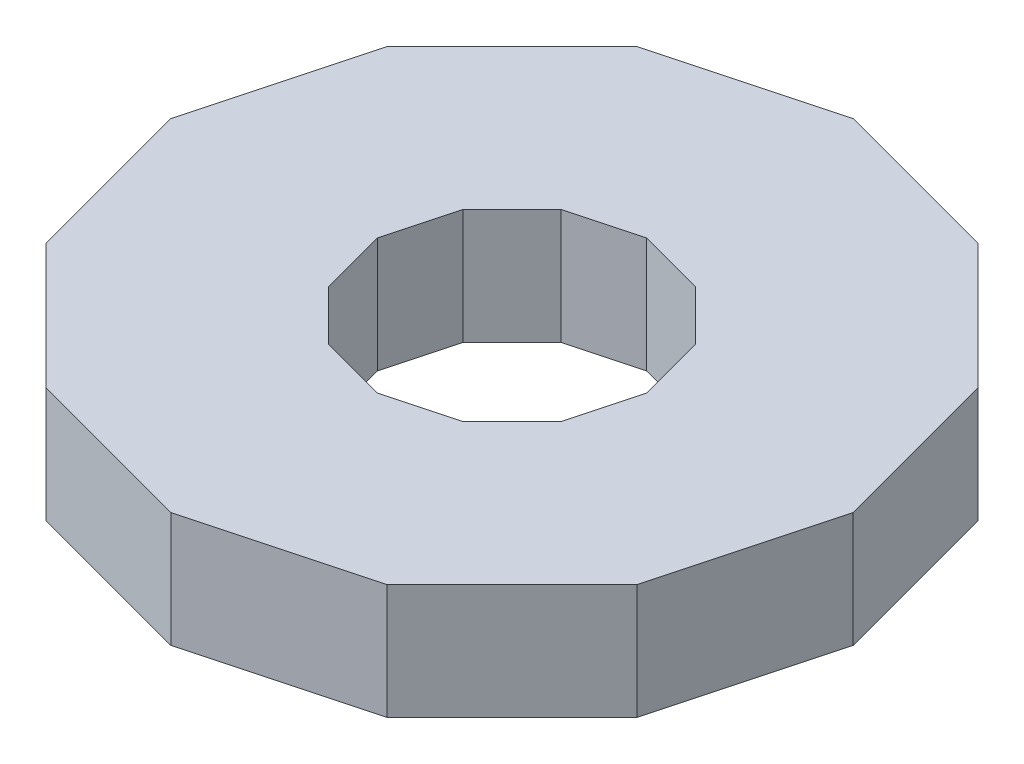
ISO-10303-21;
HEADER;
FILE_DESCRIPTION(('STEP AP214'),'2;1');
FILE_NAME('part.step','',(''),(''),'','','');
FILE_SCHEMA(('AUTOMOTIVE_DESIGN { 1 0 10303 214 1 1 1 1 }'));
ENDSEC;
DATA;
#1=APPLICATION_CONTEXT('core data for automotive mechanical design processes');
#2=APPLICATION_PROTOCOL_DEFINITION('international standard','automotive_design',2000,#1);
#3=PRODUCT_CONTEXT('',#1,'mechanical');
#4=PRODUCT('Part','Part','',(#3));
#5=PRODUCT_RELATED_PRODUCT_CATEGORY('part','',(#4));
#6=PRODUCT_DEFINITION_FORMATION('','',#4);
#7=PRODUCT_DEFINITION_CONTEXT('part definition',#1,'design');
#8=PRODUCT_DEFINITION('design','',#6,#7);
#9=PRODUCT_DEFINITION_SHAPE('','',#8);
#10=(LENGTH_UNIT() NAMED_UNIT(*) SI_UNIT(.MILLI.,.METRE.));
#11=(NAMED_UNIT(*) PLANE_ANGLE_UNIT() SI_UNIT($,.RADIAN.));
#12=(NAMED_UNIT(*) SI_UNIT($,.STERADIAN.) SOLID_ANGLE_UNIT());
#13=UNCERTAINTY_MEASURE_WITH_UNIT(LENGTH_MEASURE(1.E-05),#10,'distance_accuracy_value','');
#14=(GEOMETRIC_REPRESENTATION_CONTEXT(3) GLOBAL_UNCERTAINTY_ASSIGNED_CONTEXT((#13)) GLOBAL_UNIT_ASSIGNED_CONTEXT((#10,
#11,#12)) REPRESENTATION_CONTEXT('',''));
#15=CARTESIAN_POINT('',(0.,0.,0.));
#16=DIRECTION('',(0.,0.,1.));
#17=DIRECTION('',(1.,0.,0.));
#18=AXIS2_PLACEMENT_3D('',#15,#16,#17);
#19=CARTESIAN_POINT('',(0.,19.05,0.));
#20=DIRECTION('',(0.,1.,0.));
#21=DIRECTION('',(0.,0.,1.));
#22=AXIS2_PLACEMENT_3D('',#19,#20,#21);
#23=PLANE('',#22);
#24=DIRECTION('',(0.258819045102521,0.,-0.965925826289068));
#25=VECTOR('',#24,1.);
#26=CARTESIAN_POINT('',(48.8692824643627,19.05,28.2146933859037));
#27=LINE('',#26,#25);
#28=CARTESIAN_POINT('',(48.8692824643627,19.05,28.2146933859037));
#29=VERTEX_POINT('',#28);
#30=CARTESIAN_POINT('',(56.4293867718074,19.05,0.));
#31=VERTEX_POINT('',#30);
#32=EDGE_CURVE('E304',#29,#31,#27,.T.);
#33=ORIENTED_EDGE('',*,*,#32,.T.);
#34=DIRECTION('',(-0.25881904510252,0.,-0.965925826289068));
#35=VECTOR('',#34,1.);
#36=CARTESIAN_POINT('',(56.4293867718074,19.05,0.));
#37=LINE('',#36,#35);
#38=CARTESIAN_POINT('',(48.8692824643627,19.05,-28.2146933859037));
#39=VERTEX_POINT('',#38);
#40=EDGE_CURVE('E308',#31,#39,#37,.T.);
#41=ORIENTED_EDGE('',*,*,#40,.T.);
#42=DIRECTION('',(-0.707106781186547,0.,-0.707106781186547));
#43=VECTOR('',#42,1.);
#44=CARTESIAN_POINT('',(48.8692824643627,19.05,-28.2146933859037));
#45=LINE('',#44,#43);
#46=CARTESIAN_POINT('',(28.2146933859037,19.05,-48.8692824643627));
#47=VERTEX_POINT('',#46);
#48=EDGE_CURVE('E312',#39,#47,#45,.T.);
#49=ORIENTED_EDGE('',*,*,#48,.T.);
#50=DIRECTION('',(-0.965925826289068,0.,-0.258819045102521));
#51=VECTOR('',#50,1.);
#52=CARTESIAN_POINT('',(28.2146933859037,19.05,-48.8692824643627));
#53=LINE('',#52,#51);
#54=CARTESIAN_POINT('',(0.,19.05,-56.4293867718074));
#55=VERTEX_POINT('',#54);
#56=EDGE_CURVE('E315',#47,#55,#53,.T.);
#57=ORIENTED_EDGE('',*,*,#56,.T.);
#58=DIRECTION('',(-0.965925826289068,0.,0.25881904510252));
#59=VECTOR('',#58,1.);
#60=CARTESIAN_POINT('',(0.,19.05,-56.4293867718074));
#61=LINE('',#60,#59);
#62=CARTESIAN_POINT('',(-28.2146933859037,19.05,-48.8692824643628));
#63=VERTEX_POINT('',#62);
#64=EDGE_CURVE('E318',#55,#63,#61,.T.);
#65=ORIENTED_EDGE('',*,*,#64,.T.);
#66=DIRECTION('',(-0.707106781186548,0.,0.707106781186547));
#67=VECTOR('',#66,1.);
#68=CARTESIAN_POINT('',(-28.2146933859037,19.05,-48.8692824643628));
#69=LINE('',#68,#67);
#70=CARTESIAN_POINT('',(-48.8692824643627,19.05,-28.2146933859037));
#71=VERTEX_POINT('',#70);
#72=EDGE_CURVE('E321',#63,#71,#69,.T.);
#73=ORIENTED_EDGE('',*,*,#72,.T.);
#74=DIRECTION('',(-0.258819045102521,0.,0.965925826289068));
#75=VECTOR('',#74,1.);
#76=CARTESIAN_POINT('',(-48.8692824643627,19.05,-28.2146933859037));
#77=LINE('',#76,#75);
#78=CARTESIAN_POINT('',(-56.4293867718074,19.05,0.));
#79=VERTEX_POINT('',#78);
#80=EDGE_CURVE('E324',#71,#79,#77,.T.);
#81=ORIENTED_EDGE('',*,*,#80,.T.);
#82=DIRECTION('',(0.25881904510252,0.,0.965925826289068));
#83=VECTOR('',#82,1.);
#84=CARTESIAN_POINT('',(-56.4293867718074,19.05,0.));
#85=LINE('',#84,#83);
#86=CARTESIAN_POINT('',(-48.8692824643628,19.05,28.2146933859037));
#87=VERTEX_POINT('',#86);
#88=EDGE_CURVE('E327',#79,#87,#85,.T.);
#89=ORIENTED_EDGE('',*,*,#88,.T.);
#90=DIRECTION('',(0.707106781186547,0.,0.707106781186548));
#91=VECTOR('',#90,1.);
#92=CARTESIAN_POINT('',(-48.8692824643628,19.05,28.2146933859037));
#93=LINE('',#92,#91);
#94=CARTESIAN_POINT('',(-28.2146933859037,19.05,48.8692824643627));
#95=VERTEX_POINT('',#94);
#96=EDGE_CURVE('E329',#87,#95,#93,.T.);
#97=ORIENTED_EDGE('',*,*,#96,.T.);
#98=DIRECTION('',(0.965925826289068,0.,0.258819045102521));
#99=VECTOR('',#98,1.);
#100=CARTESIAN_POINT('',(-28.2146933859037,19.05,48.8692824643627));
#101=LINE('',#100,#99);
#102=CARTESIAN_POINT('',(0.,19.05,56.4293867718074));
#103=VERTEX_POINT('',#102);
#104=EDGE_CURVE('E332',#95,#103,#101,.T.);
#105=ORIENTED_EDGE('',*,*,#104,.T.);
#106=DIRECTION('',(0.965925826289068,0.,-0.25881904510252));
#107=VECTOR('',#106,1.);
#108=CARTESIAN_POINT('',(0.,19.05,56.4293867718074));
#109=LINE('',#108,#107);
#110=CARTESIAN_POINT('',(28.2146933859037,19.05,48.8692824643628));
#111=VERTEX_POINT('',#110);
#112=EDGE_CURVE('E334',#103,#111,#109,.T.);
#113=ORIENTED_EDGE('',*,*,#112,.T.);
#114=DIRECTION('',(0.707106781186548,0.,-0.707106781186547));
#115=VECTOR('',#114,1.);
#116=CARTESIAN_POINT('',(28.2146933859037,19.05,48.8692824643628));
#117=LINE('',#116,#115);
#118=EDGE_CURVE('E336',#111,#29,#117,.T.);
#119=ORIENTED_EDGE('',*,*,#118,.T.);
#120=EDGE_LOOP('',(#33,#41,#49,#57,#65,#73,#81,#89,#97,#105,#113,#119));
#121=FACE_BOUND('',#120,.T.);
#122=DIRECTION('',(-0.25881904510252,0.,-0.965925826289069));
#123=VECTOR('',#122,1.);
#124=CARTESIAN_POINT('',(22.2445672946664,19.05,0.));
#125=LINE('',#124,#123);
#126=CARTESIAN_POINT('',(22.2445672946664,19.05,0.));
#127=VERTEX_POINT('',#126);
#128=CARTESIAN_POINT('',(19.2643603733736,19.05,-11.1222836473332));
#129=VERTEX_POINT('',#128);
#130=EDGE_CURVE('E204',#127,#129,#125,.T.);
#131=ORIENTED_EDGE('',*,*,#130,.F.);
#132=DIRECTION('',(0.258819045102521,0.,-0.965925826289068));
#133=VECTOR('',#132,1.);
#134=CARTESIAN_POINT('',(19.2643603733736,19.05,11.1222836473332));
#135=LINE('',#134,#133);
#136=CARTESIAN_POINT('',(19.2643603733736,19.05,11.1222836473332));
#137=VERTEX_POINT('',#136);
#138=EDGE_CURVE('E195',#137,#127,#135,.T.);
#139=ORIENTED_EDGE('',*,*,#138,.F.);
#140=DIRECTION('',(0.707106781186548,0.,-0.707106781186547));
#141=VECTOR('',#140,1.);
#142=CARTESIAN_POINT('',(11.1222836473332,19.05,19.2643603733736));
#143=LINE('',#142,#141);
#144=CARTESIAN_POINT('',(11.1222836473332,19.05,19.2643603733736));
#145=VERTEX_POINT('',#144);
#146=EDGE_CURVE('E241',#145,#137,#143,.T.);
#147=ORIENTED_EDGE('',*,*,#146,.F.);
#148=DIRECTION('',(0.965925826289069,0.,-0.25881904510252));
#149=VECTOR('',#148,1.);
#150=CARTESIAN_POINT('',(0.,19.05,22.2445672946664));
#151=LINE('',#150,#149);
#152=CARTESIAN_POINT('',(0.,19.05,22.2445672946664));
#153=VERTEX_POINT('',#152);
#154=EDGE_CURVE('E239',#153,#145,#151,.T.);
#155=ORIENTED_EDGE('',*,*,#154,.F.);
#156=DIRECTION('',(0.965925826289068,0.,0.258819045102521));
#157=VECTOR('',#156,1.);
#158=CARTESIAN_POINT('',(-11.1222836473332,19.05,19.2643603733736));
#159=LINE('',#158,#157);
#160=CARTESIAN_POINT('',(-11.1222836473332,19.05,19.2643603733736));
#161=VERTEX_POINT('',#160);
#162=EDGE_CURVE('E237',#161,#153,#159,.T.);
#163=ORIENTED_EDGE('',*,*,#162,.F.);
#164=DIRECTION('',(0.707106781186547,0.,0.707106781186547));
#165=VECTOR('',#164,1.);
#166=CARTESIAN_POINT('',(-19.2643603733736,19.05,11.1222836473332));
#167=LINE('',#166,#165);
#168=CARTESIAN_POINT('',(-19.2643603733736,19.05,11.1222836473332));
#169=VERTEX_POINT('',#168);
#170=EDGE_CURVE('E235',#169,#161,#167,.T.);
#171=ORIENTED_EDGE('',*,*,#170,.F.);
#172=DIRECTION('',(0.25881904510252,0.,0.965925826289068));
#173=VECTOR('',#172,1.);
#174=CARTESIAN_POINT('',(-22.2445672946664,19.05,0.));
#175=LINE('',#174,#173);
#176=CARTESIAN_POINT('',(-22.2445672946664,19.05,0.));
#177=VERTEX_POINT('',#176);
#178=EDGE_CURVE('E233',#177,#169,#175,.T.);
#179=ORIENTED_EDGE('',*,*,#178,.F.);
#180=DIRECTION('',(-0.258819045102521,0.,0.965925826289068));
#181=VECTOR('',#180,1.);
#182=CARTESIAN_POINT('',(-19.2643603733736,19.05,-11.1222836473332));
#183=LINE('',#182,#181);
#184=CARTESIAN_POINT('',(-19.2643603733736,19.05,-11.1222836473332));
#185=VERTEX_POINT('',#184);
#186=EDGE_CURVE('E230',#185,#177,#183,.T.);
#187=ORIENTED_EDGE('',*,*,#186,.F.);
#188=DIRECTION('',(-0.707106781186548,0.,0.707106781186547));
#189=VECTOR('',#188,1.);
#190=CARTESIAN_POINT('',(-11.1222836473332,19.05,-19.2643603733736));
#191=LINE('',#190,#189);
#192=CARTESIAN_POINT('',(-11.1222836473332,19.05,-19.2643603733736));
#193=VERTEX_POINT('',#192);
#194=EDGE_CURVE('E228',#193,#185,#191,.T.);
#195=ORIENTED_EDGE('',*,*,#194,.F.);
#196=DIRECTION('',(-0.965925826289068,0.,0.258819045102521));
#197=VECTOR('',#196,1.);
#198=CARTESIAN_POINT('',(0.,19.05,-22.2445672946664));
#199=LINE('',#198,#197);
#200=CARTESIAN_POINT('',(0.,19.05,-22.2445672946664));
#201=VERTEX_POINT('',#200);
#202=EDGE_CURVE('E226',#201,#193,#199,.T.);
#203=ORIENTED_EDGE('',*,*,#202,.F.);
#204=DIRECTION('',(-0.965925826289068,0.,-0.258819045102521));
#205=VECTOR('',#204,1.);
#206=CARTESIAN_POINT('',(11.1222836473332,19.05,-19.2643603733736));
#207=LINE('',#206,#205);
#208=CARTESIAN_POINT('',(11.1222836473332,19.05,-19.2643603733736));
#209=VERTEX_POINT('',#208);
#210=EDGE_CURVE('E222',#209,#201,#207,.T.);
#211=ORIENTED_EDGE('',*,*,#210,.F.);
#212=DIRECTION('',(-0.707106781186547,0.,-0.707106781186548));
#213=VECTOR('',#212,1.);
#214=CARTESIAN_POINT('',(19.2643603733736,19.05,-11.1222836473332));
#215=LINE('',#214,#213);
#216=EDGE_CURVE('E217',#129,#209,#215,.T.);
#217=ORIENTED_EDGE('',*,*,#216,.F.);
#218=EDGE_LOOP('',(#131,#139,#147,#155,#163,#171,#179,#187,#195,#203,#211,#217));
#219=FACE_BOUND('',#218,.T.);
#220=ADVANCED_FACE('F34',(#121,#219),#23,.T.);
#221=CARTESIAN_POINT('',(0.,0.,0.));
#222=DIRECTION('',(0.,1.,0.));
#223=DIRECTION('',(0.,0.,1.));
#224=AXIS2_PLACEMENT_3D('',#221,#222,#223);
#225=PLANE('',#224);
#226=DIRECTION('',(0.258819045102521,0.,-0.965925826289068));
#227=VECTOR('',#226,1.);
#228=CARTESIAN_POINT('',(48.8692824643627,0.,28.2146933859037));
#229=LINE('',#228,#227);
#230=CARTESIAN_POINT('',(48.8692824643627,0.,28.2146933859037));
#231=VERTEX_POINT('',#230);
#232=CARTESIAN_POINT('',(56.4293867718074,0.,0.));
#233=VERTEX_POINT('',#232);
#234=EDGE_CURVE('E212',#231,#233,#229,.T.);
#235=ORIENTED_EDGE('',*,*,#234,.F.);
#236=DIRECTION('',(0.707106781186548,0.,-0.707106781186547));
#237=VECTOR('',#236,1.);
#238=CARTESIAN_POINT('',(28.2146933859037,0.,48.8692824643628));
#239=LINE('',#238,#237);
#240=CARTESIAN_POINT('',(28.2146933859037,0.,48.8692824643628));
#241=VERTEX_POINT('',#240);
#242=EDGE_CURVE('E309',#241,#231,#239,.T.);
#243=ORIENTED_EDGE('',*,*,#242,.F.);
#244=DIRECTION('',(0.965925826289068,0.,-0.25881904510252));
#245=VECTOR('',#244,1.);
#246=CARTESIAN_POINT('',(0.,0.,56.4293867718074));
#247=LINE('',#246,#245);
#248=CARTESIAN_POINT('',(0.,0.,56.4293867718074));
#249=VERTEX_POINT('',#248);
#250=EDGE_CURVE('E362',#249,#241,#247,.T.);
#251=ORIENTED_EDGE('',*,*,#250,.F.);
#252=DIRECTION('',(0.965925826289068,0.,0.258819045102521));
#253=VECTOR('',#252,1.);
#254=CARTESIAN_POINT('',(-28.2146933859037,0.,48.8692824643627));
#255=LINE('',#254,#253);
#256=CARTESIAN_POINT('',(-28.2146933859037,0.,48.8692824643627));
#257=VERTEX_POINT('',#256);
#258=EDGE_CURVE('E359',#257,#249,#255,.T.);
#259=ORIENTED_EDGE('',*,*,#258,.F.);
#260=DIRECTION('',(0.707106781186547,0.,0.707106781186548));
#261=VECTOR('',#260,1.);
#262=CARTESIAN_POINT('',(-48.8692824643628,0.,28.2146933859037));
#263=LINE('',#262,#261);
#264=CARTESIAN_POINT('',(-48.8692824643628,0.,28.2146933859037));
#265=VERTEX_POINT('',#264);
#266=EDGE_CURVE('E356',#265,#257,#263,.T.);
#267=ORIENTED_EDGE('',*,*,#266,.F.);
#268=DIRECTION('',(0.25881904510252,0.,0.965925826289068));
#269=VECTOR('',#268,1.);
#270=CARTESIAN_POINT('',(-56.4293867718074,0.,0.));
#271=LINE('',#270,#269);
#272=CARTESIAN_POINT('',(-56.4293867718074,0.,0.));
#273=VERTEX_POINT('',#272);
#274=EDGE_CURVE('E354',#273,#265,#271,.T.);
#275=ORIENTED_EDGE('',*,*,#274,.F.);
#276=DIRECTION('',(-0.258819045102521,0.,0.965925826289068));
#277=VECTOR('',#276,1.);
#278=CARTESIAN_POINT('',(-48.8692824643627,0.,-28.2146933859037));
#279=LINE('',#278,#277);
#280=CARTESIAN_POINT('',(-48.8692824643627,0.,-28.2146933859037));
#281=VERTEX_POINT('',#280);
#282=EDGE_CURVE('E352',#281,#273,#279,.T.);
#283=ORIENTED_EDGE('',*,*,#282,.F.);
#284=DIRECTION('',(-0.707106781186548,0.,0.707106781186547));
#285=VECTOR('',#284,1.);
#286=CARTESIAN_POINT('',(-28.2146933859037,0.,-48.8692824643628));
#287=LINE('',#286,#285);
#288=CARTESIAN_POINT('',(-28.2146933859037,0.,-48.8692824643628));
#289=VERTEX_POINT('',#288);
#290=EDGE_CURVE('E350',#289,#281,#287,.T.);
#291=ORIENTED_EDGE('',*,*,#290,.F.);
#292=DIRECTION('',(-0.965925826289068,0.,0.25881904510252));
#293=VECTOR('',#292,1.);
#294=CARTESIAN_POINT('',(0.,0.,-56.4293867718074));
#295=LINE('',#294,#293);
#296=CARTESIAN_POINT('',(0.,0.,-56.4293867718074));
#297=VERTEX_POINT('',#296);
#298=EDGE_CURVE('E348',#297,#289,#295,.T.);
#299=ORIENTED_EDGE('',*,*,#298,.F.);
#300=DIRECTION('',(-0.965925826289068,0.,-0.258819045102521));
#301=VECTOR('',#300,1.);
#302=CARTESIAN_POINT('',(28.2146933859037,0.,-48.8692824643627));
#303=LINE('',#302,#301);
#304=CARTESIAN_POINT('',(28.2146933859037,0.,-48.8692824643627));
#305=VERTEX_POINT('',#304);
#306=EDGE_CURVE('E345',#305,#297,#303,.T.);
#307=ORIENTED_EDGE('',*,*,#306,.F.);
#308=DIRECTION('',(-0.707106781186547,0.,-0.707106781186547));
#309=VECTOR('',#308,1.);
#310=CARTESIAN_POINT('',(48.8692824643627,0.,-28.2146933859037));
#311=LINE('',#310,#309);
#312=CARTESIAN_POINT('',(48.8692824643627,0.,-28.2146933859037));
#313=VERTEX_POINT('',#312);
#314=EDGE_CURVE('E343',#313,#305,#311,.T.);
#315=ORIENTED_EDGE('',*,*,#314,.F.);
#316=DIRECTION('',(-0.25881904510252,0.,-0.965925826289068));
#317=VECTOR('',#316,1.);
#318=CARTESIAN_POINT('',(56.4293867718074,0.,0.));
#319=LINE('',#318,#317);
#320=EDGE_CURVE('E341',#233,#313,#319,.T.);
#321=ORIENTED_EDGE('',*,*,#320,.F.);
#322=EDGE_LOOP('',(#235,#243,#251,#259,#267,#275,#283,#291,#299,#307,#315,#321));
#323=FACE_BOUND('',#322,.T.);
#324=DIRECTION('',(0.258819045102521,0.,-0.965925826289068));
#325=VECTOR('',#324,1.);
#326=CARTESIAN_POINT('',(19.2643603733736,0.,11.1222836473332));
#327=LINE('',#326,#325);
#328=CARTESIAN_POINT('',(19.2643603733736,0.,11.1222836473332));
#329=VERTEX_POINT('',#328);
#330=CARTESIAN_POINT('',(22.2445672946664,0.,0.));
#331=VERTEX_POINT('',#330);
#332=EDGE_CURVE('E57',#329,#331,#327,.T.);
#333=ORIENTED_EDGE('',*,*,#332,.T.);
#334=DIRECTION('',(-0.25881904510252,0.,-0.965925826289069));
#335=VECTOR('',#334,1.);
#336=CARTESIAN_POINT('',(22.2445672946664,0.,0.));
#337=LINE('',#336,#335);
#338=CARTESIAN_POINT('',(19.2643603733736,0.,-11.1222836473332));
#339=VERTEX_POINT('',#338);
#340=EDGE_CURVE('E211',#331,#339,#337,.T.);
#341=ORIENTED_EDGE('',*,*,#340,.T.);
#342=DIRECTION('',(-0.707106781186547,0.,-0.707106781186548));
#343=VECTOR('',#342,1.);
#344=CARTESIAN_POINT('',(19.2643603733736,0.,-11.1222836473332));
#345=LINE('',#344,#343);
#346=CARTESIAN_POINT('',(11.1222836473332,0.,-19.2643603733736));
#347=VERTEX_POINT('',#346);
#348=EDGE_CURVE('E248',#339,#347,#345,.T.);
#349=ORIENTED_EDGE('',*,*,#348,.T.);
#350=DIRECTION('',(-0.965925826289068,0.,-0.258819045102521));
#351=VECTOR('',#350,1.);
#352=CARTESIAN_POINT('',(11.1222836473332,0.,-19.2643603733736));
#353=LINE('',#352,#351);
#354=CARTESIAN_POINT('',(0.,0.,-22.2445672946664));
#355=VERTEX_POINT('',#354);
#356=EDGE_CURVE('E251',#347,#355,#353,.T.);
#357=ORIENTED_EDGE('',*,*,#356,.T.);
#358=DIRECTION('',(-0.965925826289068,0.,0.258819045102521));
#359=VECTOR('',#358,1.);
#360=CARTESIAN_POINT('',(0.,0.,-22.2445672946664));
#361=LINE('',#360,#359);
#362=CARTESIAN_POINT('',(-11.1222836473332,0.,-19.2643603733736));
#363=VERTEX_POINT('',#362);
#364=EDGE_CURVE('E255',#355,#363,#361,.T.);
#365=ORIENTED_EDGE('',*,*,#364,.T.);
#366=DIRECTION('',(-0.707106781186548,0.,0.707106781186547));
#367=VECTOR('',#366,1.);
#368=CARTESIAN_POINT('',(-11.1222836473332,0.,-19.2643603733736));
#369=LINE('',#368,#367);
#370=CARTESIAN_POINT('',(-19.2643603733736,0.,-11.1222836473332));
#371=VERTEX_POINT('',#370);
#372=EDGE_CURVE('E259',#363,#371,#369,.T.);
#373=ORIENTED_EDGE('',*,*,#372,.T.);
#374=DIRECTION('',(-0.258819045102521,0.,0.965925826289068));
#375=VECTOR('',#374,1.);
#376=CARTESIAN_POINT('',(-19.2643603733736,0.,-11.1222836473332));
#377=LINE('',#376,#375);
#378=CARTESIAN_POINT('',(-22.2445672946664,0.,0.));
#379=VERTEX_POINT('',#378);
#380=EDGE_CURVE('E263',#371,#379,#377,.T.);
#381=ORIENTED_EDGE('',*,*,#380,.T.);
#382=DIRECTION('',(0.25881904510252,0.,0.965925826289068));
#383=VECTOR('',#382,1.);
#384=CARTESIAN_POINT('',(-22.2445672946664,0.,0.));
#385=LINE('',#384,#383);
#386=CARTESIAN_POINT('',(-19.2643603733736,0.,11.1222836473332));
#387=VERTEX_POINT('',#386);
#388=EDGE_CURVE('E267',#379,#387,#385,.T.);
#389=ORIENTED_EDGE('',*,*,#388,.T.);
#390=DIRECTION('',(0.707106781186547,0.,0.707106781186547));
#391=VECTOR('',#390,1.);
#392=CARTESIAN_POINT('',(-19.2643603733736,0.,11.1222836473332));
#393=LINE('',#392,#391);
#394=CARTESIAN_POINT('',(-11.1222836473332,0.,19.2643603733736));
#395=VERTEX_POINT('',#394);
#396=EDGE_CURVE('E270',#387,#395,#393,.T.);
#397=ORIENTED_EDGE('',*,*,#396,.T.);
#398=DIRECTION('',(0.965925826289068,0.,0.258819045102521));
#399=VECTOR('',#398,1.);
#400=CARTESIAN_POINT('',(-11.1222836473332,0.,19.2643603733736));
#401=LINE('',#400,#399);
#402=CARTESIAN_POINT('',(0.,0.,22.2445672946664));
#403=VERTEX_POINT('',#402);
#404=EDGE_CURVE('E273',#395,#403,#401,.T.);
#405=ORIENTED_EDGE('',*,*,#404,.T.);
#406=DIRECTION('',(0.965925826289069,0.,-0.25881904510252));
#407=VECTOR('',#406,1.);
#408=CARTESIAN_POINT('',(0.,0.,22.2445672946664));
#409=LINE('',#408,#407);
#410=CARTESIAN_POINT('',(11.1222836473332,0.,19.2643603733736));
#411=VERTEX_POINT('',#410);
#412=EDGE_CURVE('E276',#403,#411,#409,.T.);
#413=ORIENTED_EDGE('',*,*,#412,.T.);
#414=DIRECTION('',(0.707106781186548,0.,-0.707106781186547));
#415=VECTOR('',#414,1.);
#416=CARTESIAN_POINT('',(11.1222836473332,0.,19.2643603733736));
#417=LINE('',#416,#415);
#418=EDGE_CURVE('E205',#411,#329,#417,.T.);
#419=ORIENTED_EDGE('',*,*,#418,.T.);
#420=EDGE_LOOP('',(#333,#341,#349,#357,#365,#373,#381,#389,#397,#405,#413,#419));
#421=FACE_BOUND('',#420,.T.);
#422=ADVANCED_FACE('F410',(#323,#421),#225,.F.);
#423=CARTESIAN_POINT('',(48.8692824643627,19.05,28.2146933859037));
#424=DIRECTION('',(-0.965925826289068,0.,-0.258819045102521));
#425=DIRECTION('',(-0.258819045102521,0.,0.965925826289068));
#426=AXIS2_PLACEMENT_3D('',#423,#424,#425);
#427=PLANE('',#426);
#428=ORIENTED_EDGE('',*,*,#234,.T.);
#429=DIRECTION('',(0.,-1.,0.));
#430=VECTOR('',#429,1.);
#431=CARTESIAN_POINT('',(56.4293867718074,19.05,0.));
#432=LINE('',#431,#430);
#433=EDGE_CURVE('E11',#31,#233,#432,.T.);
#434=ORIENTED_EDGE('',*,*,#433,.F.);
#435=ORIENTED_EDGE('',*,*,#32,.F.);
#436=DIRECTION('',(0.,-1.,0.));
#437=VECTOR('',#436,1.);
#438=CARTESIAN_POINT('',(48.8692824643627,19.05,28.2146933859037));
#439=LINE('',#438,#437);
#440=EDGE_CURVE('E338',#29,#231,#439,.T.);
#441=ORIENTED_EDGE('',*,*,#440,.T.);
#442=EDGE_LOOP('',(#428,#434,#435,#441));
#443=FACE_BOUND('',#442,.T.);
#444=ADVANCED_FACE('F36',(#443),#427,.F.);
#445=CARTESIAN_POINT('',(56.4293867718074,19.05,0.));
#446=DIRECTION('',(-0.965925826289068,0.,0.25881904510252));
#447=DIRECTION('',(0.25881904510252,0.,0.965925826289068));
#448=AXIS2_PLACEMENT_3D('',#445,#446,#447);
#449=PLANE('',#448);
#450=ORIENTED_EDGE('',*,*,#320,.T.);
#451=DIRECTION('',(0.,-1.,0.));
#452=VECTOR('',#451,1.);
#453=CARTESIAN_POINT('',(48.8692824643627,19.05,-28.2146933859037));
#454=LINE('',#453,#452);
#455=EDGE_CURVE('E42',#39,#313,#454,.T.);
#456=ORIENTED_EDGE('',*,*,#455,.F.);
#457=ORIENTED_EDGE('',*,*,#40,.F.);
#458=ORIENTED_EDGE('',*,*,#433,.T.);
#459=EDGE_LOOP('',(#450,#456,#457,#458));
#460=FACE_BOUND('',#459,.T.);
#461=ADVANCED_FACE('F427',(#460),#449,.F.);
#462=CARTESIAN_POINT('',(48.8692824643627,19.05,-28.2146933859037));
#463=DIRECTION('',(-0.707106781186547,0.,0.707106781186547));
#464=DIRECTION('',(0.707106781186548,0.,0.707106781186548));
#465=AXIS2_PLACEMENT_3D('',#462,#463,#464);
#466=PLANE('',#465);
#467=ORIENTED_EDGE('',*,*,#314,.T.);
#468=DIRECTION('',(0.,-1.,0.));
#469=VECTOR('',#468,1.);
#470=CARTESIAN_POINT('',(28.2146933859037,19.05,-48.8692824643627));
#471=LINE('',#470,#469);
#472=EDGE_CURVE('E395',#47,#305,#471,.T.);
#473=ORIENTED_EDGE('',*,*,#472,.F.);
#474=ORIENTED_EDGE('',*,*,#48,.F.);
#475=ORIENTED_EDGE('',*,*,#455,.T.);
#476=EDGE_LOOP('',(#467,#473,#474,#475));
#477=FACE_BOUND('',#476,.T.);
#478=ADVANCED_FACE('F404',(#477),#466,.F.);
#479=CARTESIAN_POINT('',(28.2146933859037,19.05,-48.8692824643627));
#480=DIRECTION('',(-0.258819045102521,0.,0.965925826289068));
#481=DIRECTION('',(0.965925826289068,0.,0.258819045102521));
#482=AXIS2_PLACEMENT_3D('',#479,#480,#481);
#483=PLANE('',#482);
#484=ORIENTED_EDGE('',*,*,#306,.T.);
#485=DIRECTION('',(0.,-1.,0.));
#486=VECTOR('',#485,1.);
#487=CARTESIAN_POINT('',(0.,19.05,-56.4293867718074));
#488=LINE('',#487,#486);
#489=EDGE_CURVE('E391',#55,#297,#488,.T.);
#490=ORIENTED_EDGE('',*,*,#489,.F.);
#491=ORIENTED_EDGE('',*,*,#56,.F.);
#492=ORIENTED_EDGE('',*,*,#472,.T.);
#493=EDGE_LOOP('',(#484,#490,#491,#492));
#494=FACE_BOUND('',#493,.T.);
#495=ADVANCED_FACE('F416',(#494),#483,.F.);
#496=CARTESIAN_POINT('',(0.,19.05,-56.4293867718074));
#497=DIRECTION('',(0.25881904510252,0.,0.965925826289068));
#498=DIRECTION('',(0.965925826289068,0.,-0.25881904510252));
#499=AXIS2_PLACEMENT_3D('',#496,#497,#498);
#500=PLANE('',#499);
#501=ORIENTED_EDGE('',*,*,#298,.T.);
#502=DIRECTION('',(0.,-1.,0.));
#503=VECTOR('',#502,1.);
#504=CARTESIAN_POINT('',(-28.2146933859037,19.05,-48.8692824643628));
#505=LINE('',#504,#503);
#506=EDGE_CURVE('E388',#63,#289,#505,.T.);
#507=ORIENTED_EDGE('',*,*,#506,.F.);
#508=ORIENTED_EDGE('',*,*,#64,.F.);
#509=ORIENTED_EDGE('',*,*,#489,.T.);
#510=EDGE_LOOP('',(#501,#507,#508,#509));
#511=FACE_BOUND('',#510,.T.);
#512=ADVANCED_FACE('F420',(#511),#500,.F.);
#513=CARTESIAN_POINT('',(-28.2146933859037,19.05,-48.8692824643628));
#514=DIRECTION('',(0.707106781186547,0.,0.707106781186548));
#515=DIRECTION('',(0.707106781186548,0.,-0.707106781186547));
#516=AXIS2_PLACEMENT_3D('',#513,#514,#515);
#517=PLANE('',#516);
#518=ORIENTED_EDGE('',*,*,#290,.T.);
#519=DIRECTION('',(0.,-1.,0.));
#520=VECTOR('',#519,1.);
#521=CARTESIAN_POINT('',(-48.8692824643627,19.05,-28.2146933859037));
#522=LINE('',#521,#520);
#523=EDGE_CURVE('E385',#71,#281,#522,.T.);
#524=ORIENTED_EDGE('',*,*,#523,.F.);
#525=ORIENTED_EDGE('',*,*,#72,.F.);
#526=ORIENTED_EDGE('',*,*,#506,.T.);
#527=EDGE_LOOP('',(#518,#524,#525,#526));
#528=FACE_BOUND('',#527,.T.);
#529=ADVANCED_FACE('F460',(#528),#517,.F.);
#530=CARTESIAN_POINT('',(-48.8692824643627,19.05,-28.2146933859037));
#531=DIRECTION('',(0.965925826289068,0.,0.258819045102521));
#532=DIRECTION('',(0.258819045102521,0.,-0.965925826289068));
#533=AXIS2_PLACEMENT_3D('',#530,#531,#532);
#534=PLANE('',#533);
#535=ORIENTED_EDGE('',*,*,#282,.T.);
#536=DIRECTION('',(0.,-1.,0.));
#537=VECTOR('',#536,1.);
#538=CARTESIAN_POINT('',(-56.4293867718074,19.05,0.));
#539=LINE('',#538,#537);
#540=EDGE_CURVE('E382',#79,#273,#539,.T.);
#541=ORIENTED_EDGE('',*,*,#540,.F.);
#542=ORIENTED_EDGE('',*,*,#80,.F.);
#543=ORIENTED_EDGE('',*,*,#523,.T.);
#544=EDGE_LOOP('',(#535,#541,#542,#543));
#545=FACE_BOUND('',#544,.T.);
#546=ADVANCED_FACE('F458',(#545),#534,.F.);
#547=CARTESIAN_POINT('',(-56.4293867718074,19.05,0.));
#548=DIRECTION('',(0.965925826289068,0.,-0.25881904510252));
#549=DIRECTION('',(-0.258819045102521,0.,-0.965925826289069));
#550=AXIS2_PLACEMENT_3D('',#547,#548,#549);
#551=PLANE('',#550);
#552=ORIENTED_EDGE('',*,*,#274,.T.);
#553=DIRECTION('',(0.,-1.,0.));
#554=VECTOR('',#553,1.);
#555=CARTESIAN_POINT('',(-48.8692824643628,19.05,28.2146933859037));
#556=LINE('',#555,#554);
#557=EDGE_CURVE('E378',#87,#265,#556,.T.);
#558=ORIENTED_EDGE('',*,*,#557,.F.);
#559=ORIENTED_EDGE('',*,*,#88,.F.);
#560=ORIENTED_EDGE('',*,*,#540,.T.);
#561=EDGE_LOOP('',(#552,#558,#559,#560));
#562=FACE_BOUND('',#561,.T.);
#563=ADVANCED_FACE('F454',(#562),#551,.F.);
#564=CARTESIAN_POINT('',(-48.8692824643628,19.05,28.2146933859037));
#565=DIRECTION('',(0.707106781186548,0.,-0.707106781186547));
#566=DIRECTION('',(-0.707106781186547,0.,-0.707106781186548));
#567=AXIS2_PLACEMENT_3D('',#564,#565,#566);
#568=PLANE('',#567);
#569=ORIENTED_EDGE('',*,*,#266,.T.);
#570=DIRECTION('',(0.,-1.,0.));
#571=VECTOR('',#570,1.);
#572=CARTESIAN_POINT('',(-28.2146933859037,19.05,48.8692824643627));
#573=LINE('',#572,#571);
#574=EDGE_CURVE('E374',#95,#257,#573,.T.);
#575=ORIENTED_EDGE('',*,*,#574,.F.);
#576=ORIENTED_EDGE('',*,*,#96,.F.);
#577=ORIENTED_EDGE('',*,*,#557,.T.);
#578=EDGE_LOOP('',(#569,#575,#576,#577));
#579=FACE_BOUND('',#578,.T.);
#580=ADVANCED_FACE('F449',(#579),#568,.F.);
#581=CARTESIAN_POINT('',(-28.2146933859037,19.05,48.8692824643627));
#582=DIRECTION('',(0.258819045102521,0.,-0.965925826289068));
#583=DIRECTION('',(-0.965925826289068,0.,-0.258819045102521));
#584=AXIS2_PLACEMENT_3D('',#581,#582,#583);
#585=PLANE('',#584);
#586=ORIENTED_EDGE('',*,*,#258,.T.);
#587=DIRECTION('',(0.,-1.,0.));
#588=VECTOR('',#587,1.);
#589=CARTESIAN_POINT('',(0.,19.05,56.4293867718074));
#590=LINE('',#589,#588);
#591=EDGE_CURVE('E370',#103,#249,#590,.T.);
#592=ORIENTED_EDGE('',*,*,#591,.F.);
#593=ORIENTED_EDGE('',*,*,#104,.F.);
#594=ORIENTED_EDGE('',*,*,#574,.T.);
#595=EDGE_LOOP('',(#586,#592,#593,#594));
#596=FACE_BOUND('',#595,.T.);
#597=ADVANCED_FACE('F443',(#596),#585,.F.);
#598=CARTESIAN_POINT('',(0.,19.05,56.4293867718074));
#599=DIRECTION('',(-0.25881904510252,0.,-0.965925826289068));
#600=DIRECTION('',(-0.965925826289068,0.,0.25881904510252));
#601=AXIS2_PLACEMENT_3D('',#598,#599,#600);
#602=PLANE('',#601);
#603=ORIENTED_EDGE('',*,*,#250,.T.);
#604=DIRECTION('',(0.,-1.,0.));
#605=VECTOR('',#604,1.);
#606=CARTESIAN_POINT('',(28.2146933859037,19.05,48.8692824643628));
#607=LINE('',#606,#605);
#608=EDGE_CURVE('E367',#111,#241,#607,.T.);
#609=ORIENTED_EDGE('',*,*,#608,.F.);
#610=ORIENTED_EDGE('',*,*,#112,.F.);
#611=ORIENTED_EDGE('',*,*,#591,.T.);
#612=EDGE_LOOP('',(#603,#609,#610,#611));
#613=FACE_BOUND('',#612,.T.);
#614=ADVANCED_FACE('F439',(#613),#602,.F.);
#615=CARTESIAN_POINT('',(28.2146933859037,19.05,48.8692824643628));
#616=DIRECTION('',(-0.707106781186547,0.,-0.707106781186548));
#617=DIRECTION('',(-0.707106781186548,0.,0.707106781186547));
#618=AXIS2_PLACEMENT_3D('',#615,#616,#617);
#619=PLANE('',#618);
#620=ORIENTED_EDGE('',*,*,#242,.T.);
#621=ORIENTED_EDGE('',*,*,#440,.F.);
#622=ORIENTED_EDGE('',*,*,#118,.F.);
#623=ORIENTED_EDGE('',*,*,#608,.T.);
#624=EDGE_LOOP('',(#620,#621,#622,#623));
#625=FACE_BOUND('',#624,.T.);
#626=ADVANCED_FACE('F434',(#625),#619,.F.);
#627=CARTESIAN_POINT('',(19.2643603733736,19.05,11.1222836473332));
#628=DIRECTION('',(-0.965925826289068,0.,-0.258819045102521));
#629=DIRECTION('',(-0.258819045102521,0.,0.965925826289068));
#630=AXIS2_PLACEMENT_3D('',#627,#628,#629);
#631=PLANE('',#630);
#632=ORIENTED_EDGE('',*,*,#332,.F.);
#633=DIRECTION('',(0.,-1.,0.));
#634=VECTOR('',#633,1.);
#635=CARTESIAN_POINT('',(19.2643603733736,19.05,11.1222836473332));
#636=LINE('',#635,#634);
#637=EDGE_CURVE('E199',#137,#329,#636,.T.);
#638=ORIENTED_EDGE('',*,*,#637,.F.);
#639=ORIENTED_EDGE('',*,*,#138,.T.);
#640=DIRECTION('',(0.,-1.,0.));
#641=VECTOR('',#640,1.);
#642=CARTESIAN_POINT('',(22.2445672946664,19.05,0.));
#643=LINE('',#642,#641);
#644=EDGE_CURVE('E198',#127,#331,#643,.T.);
#645=ORIENTED_EDGE('',*,*,#644,.T.);
#646=EDGE_LOOP('',(#632,#638,#639,#645));
#647=FACE_BOUND('',#646,.T.);
#648=ADVANCED_FACE('F197',(#647),#631,.T.);
#649=CARTESIAN_POINT('',(22.2445672946664,19.05,0.));
#650=DIRECTION('',(-0.965925826289068,0.,0.25881904510252));
#651=DIRECTION('',(0.25881904510252,0.,0.965925826289068));
#652=AXIS2_PLACEMENT_3D('',#649,#650,#651);
#653=PLANE('',#652);
#654=ORIENTED_EDGE('',*,*,#340,.F.);
#655=ORIENTED_EDGE('',*,*,#644,.F.);
#656=ORIENTED_EDGE('',*,*,#130,.T.);
#657=DIRECTION('',(0.,-1.,0.));
#658=VECTOR('',#657,1.);
#659=CARTESIAN_POINT('',(19.2643603733736,19.05,-11.1222836473332));
#660=LINE('',#659,#658);
#661=EDGE_CURVE('E213',#129,#339,#660,.T.);
#662=ORIENTED_EDGE('',*,*,#661,.T.);
#663=EDGE_LOOP('',(#654,#655,#656,#662));
#664=FACE_BOUND('',#663,.T.);
#665=ADVANCED_FACE('F208',(#664),#653,.T.);
#666=CARTESIAN_POINT('',(19.2643603733736,19.05,-11.1222836473332));
#667=DIRECTION('',(-0.707106781186548,0.,0.707106781186547));
#668=DIRECTION('',(0.707106781186547,0.,0.707106781186548));
#669=AXIS2_PLACEMENT_3D('',#666,#667,#668);
#670=PLANE('',#669);
#671=ORIENTED_EDGE('',*,*,#348,.F.);
#672=ORIENTED_EDGE('',*,*,#661,.F.);
#673=ORIENTED_EDGE('',*,*,#216,.T.);
#674=DIRECTION('',(0.,-1.,0.));
#675=VECTOR('',#674,1.);
#676=CARTESIAN_POINT('',(11.1222836473332,19.05,-19.2643603733736));
#677=LINE('',#676,#675);
#678=EDGE_CURVE('E300',#209,#347,#677,.T.);
#679=ORIENTED_EDGE('',*,*,#678,.T.);
#680=EDGE_LOOP('',(#671,#672,#673,#679));
#681=FACE_BOUND('',#680,.T.);
#682=ADVANCED_FACE('F518',(#681),#670,.T.);
#683=CARTESIAN_POINT('',(11.1222836473332,19.05,-19.2643603733736));
#684=DIRECTION('',(-0.258819045102521,0.,0.965925826289068));
#685=DIRECTION('',(0.965925826289068,0.,0.258819045102521));
#686=AXIS2_PLACEMENT_3D('',#683,#684,#685);
#687=PLANE('',#686);
#688=ORIENTED_EDGE('',*,*,#356,.F.);
#689=ORIENTED_EDGE('',*,*,#678,.F.);
#690=ORIENTED_EDGE('',*,*,#210,.T.);
#691=DIRECTION('',(0.,-1.,0.));
#692=VECTOR('',#691,1.);
#693=CARTESIAN_POINT('',(0.,19.05,-22.2445672946664));
#694=LINE('',#693,#692);
#695=EDGE_CURVE('E297',#201,#355,#694,.T.);
#696=ORIENTED_EDGE('',*,*,#695,.T.);
#697=EDGE_LOOP('',(#688,#689,#690,#696));
#698=FACE_BOUND('',#697,.T.);
#699=ADVANCED_FACE('F524',(#698),#687,.T.);
#700=CARTESIAN_POINT('',(0.,19.05,-22.2445672946664));
#701=DIRECTION('',(0.258819045102521,0.,0.965925826289068));
#702=DIRECTION('',(0.965925826289068,0.,-0.258819045102521));
#703=AXIS2_PLACEMENT_3D('',#700,#701,#702);
#704=PLANE('',#703);
#705=ORIENTED_EDGE('',*,*,#364,.F.);
#706=ORIENTED_EDGE('',*,*,#695,.F.);
#707=ORIENTED_EDGE('',*,*,#202,.T.);
#708=DIRECTION('',(0.,-1.,0.));
#709=VECTOR('',#708,1.);
#710=CARTESIAN_POINT('',(-11.1222836473332,19.05,-19.2643603733736));
#711=LINE('',#710,#709);
#712=EDGE_CURVE('E294',#193,#363,#711,.T.);
#713=ORIENTED_EDGE('',*,*,#712,.T.);
#714=EDGE_LOOP('',(#705,#706,#707,#713));
#715=FACE_BOUND('',#714,.T.);
#716=ADVANCED_FACE('F532',(#715),#704,.T.);
#717=CARTESIAN_POINT('',(-11.1222836473332,19.05,-19.2643603733736));
#718=DIRECTION('',(0.707106781186547,0.,0.707106781186548));
#719=DIRECTION('',(0.707106781186548,0.,-0.707106781186547));
#720=AXIS2_PLACEMENT_3D('',#717,#718,#719);
#721=PLANE('',#720);
#722=ORIENTED_EDGE('',*,*,#372,.F.);
#723=ORIENTED_EDGE('',*,*,#712,.F.);
#724=ORIENTED_EDGE('',*,*,#194,.T.);
#725=DIRECTION('',(0.,-1.,0.));
#726=VECTOR('',#725,1.);
#727=CARTESIAN_POINT('',(-19.2643603733736,19.05,-11.1222836473332));
#728=LINE('',#727,#726);
#729=EDGE_CURVE('E292',#185,#371,#728,.T.);
#730=ORIENTED_EDGE('',*,*,#729,.T.);
#731=EDGE_LOOP('',(#722,#723,#724,#730));
#732=FACE_BOUND('',#731,.T.);
#733=ADVANCED_FACE('F540',(#732),#721,.T.);
#734=CARTESIAN_POINT('',(-19.2643603733736,19.05,-11.1222836473332));
#735=DIRECTION('',(0.965925826289068,0.,0.258819045102521));
#736=DIRECTION('',(0.258819045102521,0.,-0.965925826289068));
#737=AXIS2_PLACEMENT_3D('',#734,#735,#736);
#738=PLANE('',#737);
#739=ORIENTED_EDGE('',*,*,#380,.F.);
#740=ORIENTED_EDGE('',*,*,#729,.F.);
#741=ORIENTED_EDGE('',*,*,#186,.T.);
#742=DIRECTION('',(0.,-1.,0.));
#743=VECTOR('',#742,1.);
#744=CARTESIAN_POINT('',(-22.2445672946664,19.05,0.));
#745=LINE('',#744,#743);
#746=EDGE_CURVE('E290',#177,#379,#745,.T.);
#747=ORIENTED_EDGE('',*,*,#746,.T.);
#748=EDGE_LOOP('',(#739,#740,#741,#747));
#749=FACE_BOUND('',#748,.T.);
#750=ADVANCED_FACE('F548',(#749),#738,.T.);
#751=CARTESIAN_POINT('',(-22.2445672946664,19.05,0.));
#752=DIRECTION('',(0.965925826289068,0.,-0.25881904510252));
#753=DIRECTION('',(-0.25881904510252,0.,-0.965925826289068));
#754=AXIS2_PLACEMENT_3D('',#751,#752,#753);
#755=PLANE('',#754);
#756=ORIENTED_EDGE('',*,*,#388,.F.);
#757=ORIENTED_EDGE('',*,*,#746,.F.);
#758=ORIENTED_EDGE('',*,*,#178,.T.);
#759=DIRECTION('',(0.,-1.,0.));
#760=VECTOR('',#759,1.);
#761=CARTESIAN_POINT('',(-19.2643603733736,19.05,11.1222836473332));
#762=LINE('',#761,#760);
#763=EDGE_CURVE('E288',#169,#387,#762,.T.);
#764=ORIENTED_EDGE('',*,*,#763,.T.);
#765=EDGE_LOOP('',(#756,#757,#758,#764));
#766=FACE_BOUND('',#765,.T.);
#767=ADVANCED_FACE('F556',(#766),#755,.T.);
#768=CARTESIAN_POINT('',(-19.2643603733736,19.05,11.1222836473332));
#769=DIRECTION('',(0.707106781186547,0.,-0.707106781186547));
#770=DIRECTION('',(-0.707106781186548,0.,-0.707106781186548));
#771=AXIS2_PLACEMENT_3D('',#768,#769,#770);
#772=PLANE('',#771);
#773=ORIENTED_EDGE('',*,*,#396,.F.);
#774=ORIENTED_EDGE('',*,*,#763,.F.);
#775=ORIENTED_EDGE('',*,*,#170,.T.);
#776=DIRECTION('',(0.,-1.,0.));
#777=VECTOR('',#776,1.);
#778=CARTESIAN_POINT('',(-11.1222836473332,19.05,19.2643603733736));
#779=LINE('',#778,#777);
#780=EDGE_CURVE('E286',#161,#395,#779,.T.);
#781=ORIENTED_EDGE('',*,*,#780,.T.);
#782=EDGE_LOOP('',(#773,#774,#775,#781));
#783=FACE_BOUND('',#782,.T.);
#784=ADVANCED_FACE('F564',(#783),#772,.T.);
#785=CARTESIAN_POINT('',(-11.1222836473332,19.05,19.2643603733736));
#786=DIRECTION('',(0.258819045102521,0.,-0.965925826289068));
#787=DIRECTION('',(-0.965925826289068,0.,-0.258819045102521));
#788=AXIS2_PLACEMENT_3D('',#785,#786,#787);
#789=PLANE('',#788);
#790=ORIENTED_EDGE('',*,*,#404,.F.);
#791=ORIENTED_EDGE('',*,*,#780,.F.);
#792=ORIENTED_EDGE('',*,*,#162,.T.);
#793=DIRECTION('',(0.,-1.,0.));
#794=VECTOR('',#793,1.);
#795=CARTESIAN_POINT('',(0.,19.05,22.2445672946664));
#796=LINE('',#795,#794);
#797=EDGE_CURVE('E284',#153,#403,#796,.T.);
#798=ORIENTED_EDGE('',*,*,#797,.T.);
#799=EDGE_LOOP('',(#790,#791,#792,#798));
#800=FACE_BOUND('',#799,.T.);
#801=ADVANCED_FACE('F572',(#800),#789,.T.);
#802=CARTESIAN_POINT('',(0.,19.05,22.2445672946664));
#803=DIRECTION('',(-0.25881904510252,0.,-0.965925826289068));
#804=DIRECTION('',(-0.965925826289068,0.,0.25881904510252));
#805=AXIS2_PLACEMENT_3D('',#802,#803,#804);
#806=PLANE('',#805);
#807=ORIENTED_EDGE('',*,*,#412,.F.);
#808=ORIENTED_EDGE('',*,*,#797,.F.);
#809=ORIENTED_EDGE('',*,*,#154,.T.);
#810=DIRECTION('',(0.,-1.,0.));
#811=VECTOR('',#810,1.);
#812=CARTESIAN_POINT('',(11.1222836473332,19.05,19.2643603733736));
#813=LINE('',#812,#811);
#814=EDGE_CURVE('E49',#145,#411,#813,.T.);
#815=ORIENTED_EDGE('',*,*,#814,.T.);
#816=EDGE_LOOP('',(#807,#808,#809,#815));
#817=FACE_BOUND('',#816,.T.);
#818=ADVANCED_FACE('F580',(#817),#806,.T.);
#819=CARTESIAN_POINT('',(11.1222836473332,19.05,19.2643603733736));
#820=DIRECTION('',(-0.707106781186547,0.,-0.707106781186548));
#821=DIRECTION('',(-0.707106781186548,0.,0.707106781186547));
#822=AXIS2_PLACEMENT_3D('',#819,#820,#821);
#823=PLANE('',#822);
#824=ORIENTED_EDGE('',*,*,#418,.F.);
#825=ORIENTED_EDGE('',*,*,#814,.F.);
#826=ORIENTED_EDGE('',*,*,#146,.T.);
#827=ORIENTED_EDGE('',*,*,#637,.T.);
#828=EDGE_LOOP('',(#824,#825,#826,#827));
#829=FACE_BOUND('',#828,.T.);
#830=ADVANCED_FACE('F588',(#829),#823,.T.);
#831=CLOSED_SHELL('',(#220,#422,#444,#461,#478,#495,#512,#529,#546,#563,#580,#597,#614,#626,
#648,#665,#682,#699,#716,#733,#750,#767,#784,#801,#818,#830));
#832=MANIFOLD_SOLID_BREP('B2',#831);
#833=ADVANCED_BREP_SHAPE_REPRESENTATION('',(#18,#832),#14);
#834=SHAPE_DEFINITION_REPRESENTATION(#9,#833);
ENDSEC;
END-ISO-10303-21;
